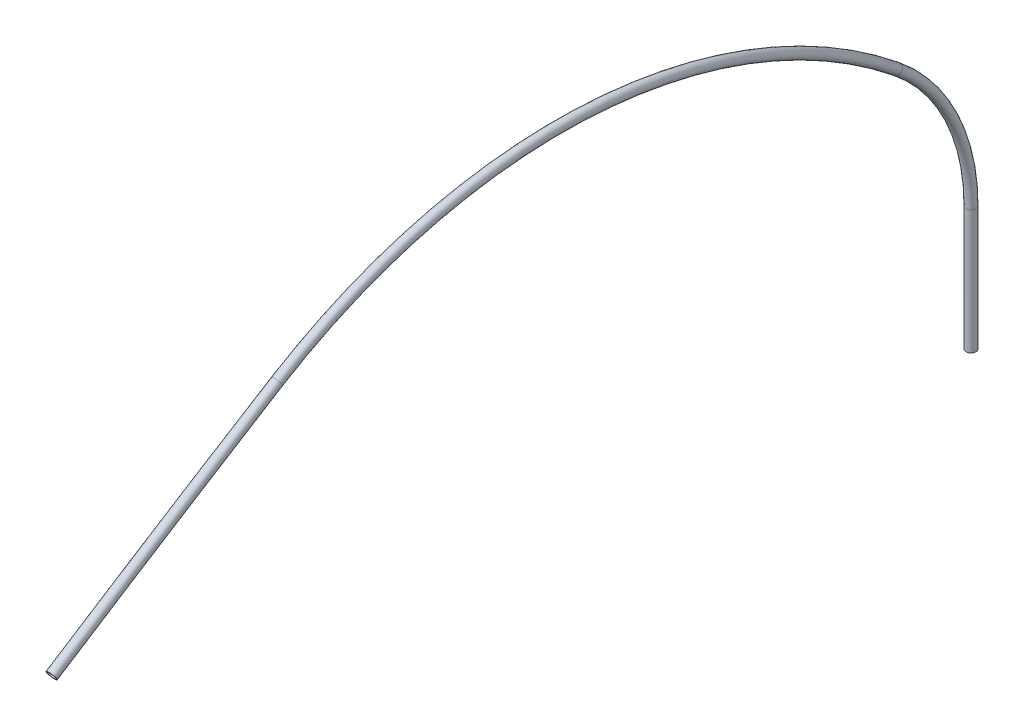
ISO-10303-21;
HEADER;
FILE_DESCRIPTION(('STEP AP214'),'2;1');
FILE_NAME('part.step','',(''),(''),'','','');
FILE_SCHEMA(('AUTOMOTIVE_DESIGN { 1 0 10303 214 1 1 1 1 }'));
ENDSEC;
DATA;
#1=APPLICATION_CONTEXT('core data for automotive mechanical design processes');
#2=APPLICATION_PROTOCOL_DEFINITION('international standard','automotive_design',2000,#1);
#3=PRODUCT_CONTEXT('',#1,'mechanical');
#4=PRODUCT('Part','Part','',(#3));
#5=PRODUCT_RELATED_PRODUCT_CATEGORY('part','',(#4));
#6=PRODUCT_DEFINITION_FORMATION('','',#4);
#7=PRODUCT_DEFINITION_CONTEXT('part definition',#1,'design');
#8=PRODUCT_DEFINITION('design','',#6,#7);
#9=PRODUCT_DEFINITION_SHAPE('','',#8);
#10=(LENGTH_UNIT() NAMED_UNIT(*) SI_UNIT(.MILLI.,.METRE.));
#11=(NAMED_UNIT(*) PLANE_ANGLE_UNIT() SI_UNIT($,.RADIAN.));
#12=(NAMED_UNIT(*) SI_UNIT($,.STERADIAN.) SOLID_ANGLE_UNIT());
#13=UNCERTAINTY_MEASURE_WITH_UNIT(LENGTH_MEASURE(1.E-05),#10,'distance_accuracy_value','');
#14=(GEOMETRIC_REPRESENTATION_CONTEXT(3) GLOBAL_UNCERTAINTY_ASSIGNED_CONTEXT((#13)) GLOBAL_UNIT_ASSIGNED_CONTEXT((#10,
#11,#12)) REPRESENTATION_CONTEXT('',''));
#15=CARTESIAN_POINT('',(0.,0.,0.));
#16=DIRECTION('',(0.,0.,1.));
#17=DIRECTION('',(1.,0.,0.));
#18=AXIS2_PLACEMENT_3D('',#15,#16,#17);
#19=CARTESIAN_POINT('',(0.,-10930.7985409335,-6245.91526817044));
#20=DIRECTION('',(1.,0.,0.));
#21=DIRECTION('',(0.,0.,-1.));
#22=AXIS2_PLACEMENT_3D('',#19,#20,#21);
#23=TOROIDAL_SURFACE('',#22,13265.560215068,5.);
#24=CARTESIAN_POINT('',(0.,362.439638334291,713.815994308379));
#25=DIRECTION('',(0.,-0.524646614967186,0.851320109831474));
#26=DIRECTION('',(0.,-0.851320109831474,-0.524646614967186));
#27=AXIS2_PLACEMENT_3D('',#24,#25,#26);
#28=CIRCLE('',#27,5.);
#29=CARTESIAN_POINT('',(0.,366.696238883451,716.439227383215));
#30=VERTEX_POINT('',#29);
#31=EDGE_CURVE('E39',#30,#30,#28,.T.);
#32=CARTESIAN_POINT('',(0.,218.772346732393,941.72390199593));
#33=DIRECTION('',(0.,-0.541827035845957,0.840490013757679));
#34=DIRECTION('',(0.,-0.840490013757679,-0.541827035845957));
#35=AXIS2_PLACEMENT_3D('',#32,#33,#34);
#36=CIRCLE('',#35,5.);
#37=CARTESIAN_POINT('',(0.,222.974796801184,944.433037175161));
#38=VERTEX_POINT('',#37);
#39=EDGE_CURVE('E10',#38,#38,#36,.T.);
#40=CARTESIAN_POINT('',(0.,-10930.7985409335,-6245.91526817044));
#41=DIRECTION('',(1.,0.,0.));
#42=DIRECTION('',(0.,0.,-1.));
#43=AXIS2_PLACEMENT_3D('',#40,#41,#42);
#44=CIRCLE('',#43,13270.560215068);
#45=EDGE_CURVE('',#30,#38,#44,.T.);
#46=ORIENTED_EDGE('',*,*,#31,.T.);
#47=ORIENTED_EDGE('',*,*,#39,.F.);
#48=ORIENTED_EDGE('',*,*,#45,.T.);
#49=ORIENTED_EDGE('',*,*,#45,.F.);
#50=EDGE_LOOP('',(#46,#48,#47,#49));
#51=FACE_BOUND('',#50,.T.);
#52=ADVANCED_FACE('F33',(#51),#23,.T.);
#53=CARTESIAN_POINT('',(0.,-100.438446726571,428.556175275386));
#54=DIRECTION('',(1.,0.,0.));
#55=DIRECTION('',(0.,0.,-1.));
#56=AXIS2_PLACEMENT_3D('',#53,#54,#55);
#57=TOROIDAL_SURFACE('',#56,543.718020654408,5.);
#58=CARTESIAN_POINT('',(0.,322.904488462449,87.3670118925306));
#59=DIRECTION('',(0.,0.6275112290231,0.7786075118119));
#60=DIRECTION('',(0.,-0.7786075118119,0.6275112290231));
#61=AXIS2_PLACEMENT_3D('',#58,#59,#60);
#62=CIRCLE('',#61,5.);
#63=CARTESIAN_POINT('',(0.,326.797526021508,84.2294557474151));
#64=VERTEX_POINT('',#63);
#65=EDGE_CURVE('E43',#64,#64,#62,.T.);
#66=CARTESIAN_POINT('',(0.,-100.438446726571,428.556175275386));
#67=DIRECTION('',(1.,0.,0.));
#68=DIRECTION('',(0.,0.,-1.));
#69=AXIS2_PLACEMENT_3D('',#66,#67,#68);
#70=CIRCLE('',#69,548.718020654408);
#71=EDGE_CURVE('',#64,#30,#70,.T.);
#72=ORIENTED_EDGE('',*,*,#65,.T.);
#73=ORIENTED_EDGE('',*,*,#31,.F.);
#74=ORIENTED_EDGE('',*,*,#71,.T.);
#75=ORIENTED_EDGE('',*,*,#71,.F.);
#76=EDGE_LOOP('',(#72,#74,#73,#75));
#77=FACE_BOUND('',#76,.T.);
#78=ADVANCED_FACE('F95',(#77),#57,.T.);
#79=CARTESIAN_POINT('',(0.,165.365990191905,214.333648058359));
#80=DIRECTION('',(1.,0.,0.));
#81=DIRECTION('',(0.,0.,-1.));
#82=AXIS2_PLACEMENT_3D('',#79,#80,#81);
#83=TOROIDAL_SURFACE('',#82,202.333648058359,5.);
#84=CARTESIAN_POINT('',(0.,165.365990191905,12.));
#85=DIRECTION('',(0.,1.,0.));
#86=DIRECTION('',(0.,0.,1.));
#87=AXIS2_PLACEMENT_3D('',#84,#85,#86);
#88=CIRCLE('',#87,5.);
#89=CARTESIAN_POINT('',(0.,165.365990191905,7.00000000000003));
#90=VERTEX_POINT('',#89);
#91=EDGE_CURVE('E47',#90,#90,#88,.T.);
#92=CARTESIAN_POINT('',(0.,165.365990191905,214.333648058359));
#93=DIRECTION('',(1.,0.,0.));
#94=DIRECTION('',(0.,0.,-1.));
#95=AXIS2_PLACEMENT_3D('',#92,#93,#94);
#96=CIRCLE('',#95,207.333648058359);
#97=EDGE_CURVE('',#90,#64,#96,.T.);
#98=ORIENTED_EDGE('',*,*,#91,.T.);
#99=ORIENTED_EDGE('',*,*,#65,.F.);
#100=ORIENTED_EDGE('',*,*,#97,.T.);
#101=ORIENTED_EDGE('',*,*,#97,.F.);
#102=EDGE_LOOP('',(#98,#100,#99,#101));
#103=FACE_BOUND('',#102,.T.);
#104=ADVANCED_FACE('F90',(#103),#83,.T.);
#105=CARTESIAN_POINT('',(0.,165.365990191905,12.));
#106=DIRECTION('',(0.,-1.,0.));
#107=DIRECTION('',(0.,0.,-1.));
#108=AXIS2_PLACEMENT_3D('',#105,#106,#107);
#109=CYLINDRICAL_SURFACE('',#108,5.);
#110=ORIENTED_EDGE('',*,*,#91,.F.);
#111=EDGE_LOOP('',(#110));
#112=FACE_BOUND('',#111,.T.);
#113=CARTESIAN_POINT('',(0.,40.,12.));
#114=DIRECTION('',(0.,1.,0.));
#115=DIRECTION('',(0.,0.,1.));
#116=AXIS2_PLACEMENT_3D('',#113,#114,#115);
#117=CIRCLE('',#116,5.);
#118=CARTESIAN_POINT('',(0.,40.,17.));
#119=VERTEX_POINT('',#118);
#120=EDGE_CURVE('E50',#119,#119,#117,.T.);
#121=ORIENTED_EDGE('',*,*,#120,.T.);
#122=EDGE_LOOP('',(#121));
#123=FACE_BOUND('',#122,.T.);
#124=ADVANCED_FACE('F82',(#112,#123),#109,.T.);
#125=CARTESIAN_POINT('',(0.,218.772346732393,941.72390199593));
#126=DIRECTION('',(0.,-0.541827035845957,0.840490013757679));
#127=DIRECTION('',(0.,-0.840490013757679,-0.541827035845957));
#128=AXIS2_PLACEMENT_3D('',#125,#126,#127);
#129=PLANE('',#128);
#130=CARTESIAN_POINT('',(0.,218.772346732392,941.723901995932));
#131=DIRECTION('',(0.,-0.541827035845957,0.840490013757679));
#132=DIRECTION('',(0.,-0.840490013757679,-0.541827035845957));
#133=AXIS2_PLACEMENT_3D('',#130,#131,#132);
#134=CIRCLE('',#133,4.);
#135=CARTESIAN_POINT('',(0.,222.134306787423,943.891210139315));
#136=VERTEX_POINT('',#135);
#137=EDGE_CURVE('E53',#136,#136,#134,.T.);
#138=ORIENTED_EDGE('',*,*,#137,.F.);
#139=EDGE_LOOP('',(#138));
#140=FACE_BOUND('',#139,.T.);
#141=ORIENTED_EDGE('',*,*,#39,.T.);
#142=EDGE_LOOP('',(#141));
#143=FACE_BOUND('',#142,.T.);
#144=ADVANCED_FACE('F80',(#140,#143),#129,.T.);
#145=CARTESIAN_POINT('',(0.,40.,12.));
#146=DIRECTION('',(0.,1.,0.));
#147=DIRECTION('',(0.,0.,1.));
#148=AXIS2_PLACEMENT_3D('',#145,#146,#147);
#149=PLANE('',#148);
#150=CARTESIAN_POINT('',(0.,40.,12.));
#151=DIRECTION('',(0.,1.,0.));
#152=DIRECTION('',(0.,0.,1.));
#153=AXIS2_PLACEMENT_3D('',#150,#151,#152);
#154=CIRCLE('',#153,4.);
#155=CARTESIAN_POINT('',(0.,40.,16.));
#156=VERTEX_POINT('',#155);
#157=EDGE_CURVE('E56',#156,#156,#154,.T.);
#158=ORIENTED_EDGE('',*,*,#157,.T.);
#159=EDGE_LOOP('',(#158));
#160=FACE_BOUND('',#159,.T.);
#161=ORIENTED_EDGE('',*,*,#120,.F.);
#162=EDGE_LOOP('',(#161));
#163=FACE_BOUND('',#162,.T.);
#164=ADVANCED_FACE('F76',(#160,#163),#149,.F.);
#165=CARTESIAN_POINT('',(0.,-10930.7985409335,-6245.91526817044));
#166=DIRECTION('',(1.,0.,0.));
#167=DIRECTION('',(0.,0.,-1.));
#168=AXIS2_PLACEMENT_3D('',#165,#166,#167);
#169=TOROIDAL_SURFACE('',#168,13265.560215068,4.);
#170=CARTESIAN_POINT('',(0.,362.439638334292,713.815994308379));
#171=DIRECTION('',(0.,0.524646614967186,-0.851320109831474));
#172=DIRECTION('',(0.,0.851320109831474,0.524646614967186));
#173=AXIS2_PLACEMENT_3D('',#170,#171,#172);
#174=CIRCLE('',#173,4.);
#175=CARTESIAN_POINT('',(0.,365.844918773618,715.914580768247));
#176=VERTEX_POINT('',#175);
#177=EDGE_CURVE('E62',#176,#176,#174,.F.);
#178=CARTESIAN_POINT('',(0.,-10930.7985409335,-6245.91526817044));
#179=DIRECTION('',(1.,0.,0.));
#180=DIRECTION('',(0.,0.,-1.));
#181=AXIS2_PLACEMENT_3D('',#178,#179,#180);
#182=CIRCLE('',#181,13269.560215068);
#183=EDGE_CURVE('',#176,#136,#182,.T.);
#184=ORIENTED_EDGE('',*,*,#177,.F.);
#185=ORIENTED_EDGE('',*,*,#137,.T.);
#186=ORIENTED_EDGE('',*,*,#183,.T.);
#187=ORIENTED_EDGE('',*,*,#183,.F.);
#188=EDGE_LOOP('',(#184,#186,#185,#187));
#189=FACE_BOUND('',#188,.T.);
#190=ADVANCED_FACE('F73',(#189),#169,.F.);
#191=CARTESIAN_POINT('',(0.,-100.438446726571,428.556175275386));
#192=DIRECTION('',(1.,0.,0.));
#193=DIRECTION('',(0.,0.,-1.));
#194=AXIS2_PLACEMENT_3D('',#191,#192,#193);
#195=TOROIDAL_SURFACE('',#194,543.718020654408,4.);
#196=CARTESIAN_POINT('',(0.,322.904488462449,87.3670118925306));
#197=DIRECTION('',(0.,-0.627511229023101,-0.7786075118119));
#198=DIRECTION('',(0.,0.7786075118119,-0.627511229023101));
#199=AXIS2_PLACEMENT_3D('',#196,#197,#198);
#200=CIRCLE('',#199,4.);
#201=CARTESIAN_POINT('',(0.,326.018918509696,84.8569669764382));
#202=VERTEX_POINT('',#201);
#203=EDGE_CURVE('E65',#202,#202,#200,.F.);
#204=CARTESIAN_POINT('',(0.,-100.438446726571,428.556175275386));
#205=DIRECTION('',(1.,0.,0.));
#206=DIRECTION('',(0.,0.,-1.));
#207=AXIS2_PLACEMENT_3D('',#204,#205,#206);
#208=CIRCLE('',#207,547.718020654408);
#209=EDGE_CURVE('',#202,#176,#208,.T.);
#210=ORIENTED_EDGE('',*,*,#203,.F.);
#211=ORIENTED_EDGE('',*,*,#177,.T.);
#212=ORIENTED_EDGE('',*,*,#209,.T.);
#213=ORIENTED_EDGE('',*,*,#209,.F.);
#214=EDGE_LOOP('',(#210,#212,#211,#213));
#215=FACE_BOUND('',#214,.T.);
#216=ADVANCED_FACE('F71',(#215),#195,.F.);
#217=CARTESIAN_POINT('',(0.,165.365990191905,214.333648058359));
#218=DIRECTION('',(1.,0.,0.));
#219=DIRECTION('',(0.,0.,-1.));
#220=AXIS2_PLACEMENT_3D('',#217,#218,#219);
#221=TOROIDAL_SURFACE('',#220,202.333648058359,4.);
#222=CARTESIAN_POINT('',(0.,165.365990191905,12.));
#223=DIRECTION('',(0.,-1.,0.));
#224=DIRECTION('',(0.,0.,-1.));
#225=AXIS2_PLACEMENT_3D('',#222,#223,#224);
#226=CIRCLE('',#225,4.);
#227=CARTESIAN_POINT('',(0.,165.365990191905,8.00000000000004));
#228=VERTEX_POINT('',#227);
#229=EDGE_CURVE('E59',#228,#228,#226,.F.);
#230=CARTESIAN_POINT('',(0.,165.365990191905,214.333648058359));
#231=DIRECTION('',(1.,0.,0.));
#232=DIRECTION('',(0.,0.,-1.));
#233=AXIS2_PLACEMENT_3D('',#230,#231,#232);
#234=CIRCLE('',#233,206.333648058359);
#235=EDGE_CURVE('',#228,#202,#234,.T.);
#236=ORIENTED_EDGE('',*,*,#229,.F.);
#237=ORIENTED_EDGE('',*,*,#203,.T.);
#238=ORIENTED_EDGE('',*,*,#235,.T.);
#239=ORIENTED_EDGE('',*,*,#235,.F.);
#240=EDGE_LOOP('',(#236,#238,#237,#239));
#241=FACE_BOUND('',#240,.T.);
#242=ADVANCED_FACE('F144',(#241),#221,.F.);
#243=CARTESIAN_POINT('',(0.,165.365990191905,12.));
#244=DIRECTION('',(0.,-1.,0.));
#245=DIRECTION('',(0.,0.,-1.));
#246=AXIS2_PLACEMENT_3D('',#243,#244,#245);
#247=CYLINDRICAL_SURFACE('',#246,4.);
#248=ORIENTED_EDGE('',*,*,#229,.T.);
#249=EDGE_LOOP('',(#248));
#250=FACE_BOUND('',#249,.T.);
#251=ORIENTED_EDGE('',*,*,#157,.F.);
#252=EDGE_LOOP('',(#251));
#253=FACE_BOUND('',#252,.T.);
#254=ADVANCED_FACE('F154',(#250,#253),#247,.F.);
#255=CLOSED_SHELL('',(#52,#78,#104,#124,#144,#164,#190,#216,#242,#254));
#256=MANIFOLD_SOLID_BREP('B2',#255);
#257=ADVANCED_BREP_SHAPE_REPRESENTATION('',(#18,#256),#14);
#258=SHAPE_DEFINITION_REPRESENTATION(#9,#257);
ENDSEC;
END-ISO-10303-21;
